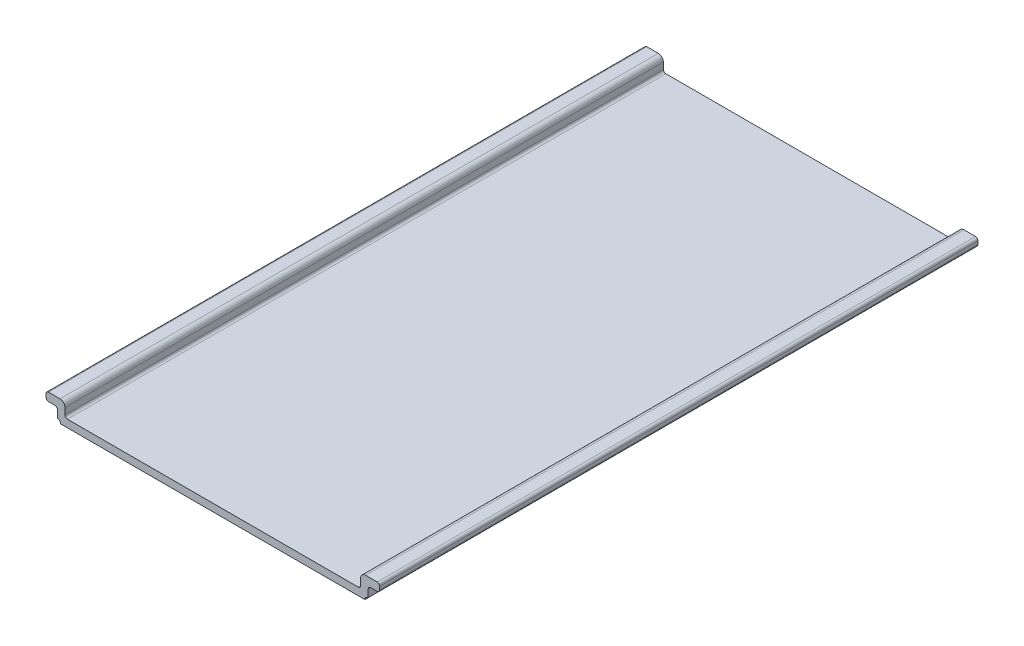
ISO-10303-21;
HEADER;
FILE_DESCRIPTION(('STEP AP214'),'2;1');
FILE_NAME('part.step','',(''),(''),'','','');
FILE_SCHEMA(('AUTOMOTIVE_DESIGN { 1 0 10303 214 1 1 1 1 }'));
ENDSEC;
DATA;
#1=APPLICATION_CONTEXT('core data for automotive mechanical design processes');
#2=APPLICATION_PROTOCOL_DEFINITION('international standard','automotive_design',2000,#1);
#3=PRODUCT_CONTEXT('',#1,'mechanical');
#4=PRODUCT('Part','Part','',(#3));
#5=PRODUCT_RELATED_PRODUCT_CATEGORY('part','',(#4));
#6=PRODUCT_DEFINITION_FORMATION('','',#4);
#7=PRODUCT_DEFINITION_CONTEXT('part definition',#1,'design');
#8=PRODUCT_DEFINITION('design','',#6,#7);
#9=PRODUCT_DEFINITION_SHAPE('','',#8);
#10=(LENGTH_UNIT() NAMED_UNIT(*) SI_UNIT(.MILLI.,.METRE.));
#11=(NAMED_UNIT(*) PLANE_ANGLE_UNIT() SI_UNIT($,.RADIAN.));
#12=(NAMED_UNIT(*) SI_UNIT($,.STERADIAN.) SOLID_ANGLE_UNIT());
#13=UNCERTAINTY_MEASURE_WITH_UNIT(LENGTH_MEASURE(1.E-05),#10,'distance_accuracy_value','');
#14=(GEOMETRIC_REPRESENTATION_CONTEXT(3) GLOBAL_UNCERTAINTY_ASSIGNED_CONTEXT((#13)) GLOBAL_UNIT_ASSIGNED_CONTEXT((#10,
#11,#12)) REPRESENTATION_CONTEXT('',''));
#15=CARTESIAN_POINT('',(0.,0.,0.));
#16=DIRECTION('',(0.,0.,1.));
#17=DIRECTION('',(1.,0.,0.));
#18=AXIS2_PLACEMENT_3D('',#15,#16,#17);
#19=CARTESIAN_POINT('',(-32.95,3.15,0.));
#20=DIRECTION('',(0.,0.,1.));
#21=DIRECTION('',(1.,0.,0.));
#22=AXIS2_PLACEMENT_3D('',#19,#20,#21);
#23=CYLINDRICAL_SURFACE('',#22,0.5);
#24=CARTESIAN_POINT('',(-32.95,3.15,0.));
#25=DIRECTION('',(0.,0.,1.));
#26=DIRECTION('',(1.,0.,0.));
#27=AXIS2_PLACEMENT_3D('',#24,#25,#26);
#28=CIRCLE('',#27,0.5);
#29=CARTESIAN_POINT('',(-33.45,3.15,0.));
#30=VERTEX_POINT('',#29);
#31=CARTESIAN_POINT('',(-32.95,2.65,0.));
#32=VERTEX_POINT('',#31);
#33=EDGE_CURVE('E182',#30,#32,#28,.T.);
#34=ORIENTED_EDGE('',*,*,#33,.T.);
#35=DIRECTION('',(0.,0.,-1.));
#36=VECTOR('',#35,1.);
#37=CARTESIAN_POINT('',(-32.95,2.65,0.));
#38=LINE('',#37,#36);
#39=CARTESIAN_POINT('',(-32.95,2.65,120.));
#40=VERTEX_POINT('',#39);
#41=EDGE_CURVE('E184',#40,#32,#38,.T.);
#42=ORIENTED_EDGE('',*,*,#41,.F.);
#43=CARTESIAN_POINT('',(-32.95,3.15,120.));
#44=DIRECTION('',(0.,0.,1.));
#45=DIRECTION('',(1.,0.,0.));
#46=AXIS2_PLACEMENT_3D('',#43,#44,#45);
#47=CIRCLE('',#46,0.5);
#48=CARTESIAN_POINT('',(-33.45,3.15,120.));
#49=VERTEX_POINT('',#48);
#50=EDGE_CURVE('E20',#40,#49,#47,.F.);
#51=ORIENTED_EDGE('',*,*,#50,.T.);
#52=DIRECTION('',(0.,0.,1.));
#53=VECTOR('',#52,1.);
#54=CARTESIAN_POINT('',(-33.45,3.15,0.));
#55=LINE('',#54,#53);
#56=EDGE_CURVE('E212',#30,#49,#55,.T.);
#57=ORIENTED_EDGE('',*,*,#56,.F.);
#58=EDGE_LOOP('',(#34,#42,#51,#57));
#59=FACE_BOUND('',#58,.T.);
#60=ADVANCED_FACE('F17',(#59),#23,.T.);
#61=CARTESIAN_POINT('',(32.95,3.15,0.));
#62=DIRECTION('',(0.,0.,1.));
#63=DIRECTION('',(1.,0.,0.));
#64=AXIS2_PLACEMENT_3D('',#61,#62,#63);
#65=CYLINDRICAL_SURFACE('',#64,0.5);
#66=CARTESIAN_POINT('',(32.95,3.15,0.));
#67=DIRECTION('',(0.,0.,1.));
#68=DIRECTION('',(1.,0.,0.));
#69=AXIS2_PLACEMENT_3D('',#66,#67,#68);
#70=CIRCLE('',#69,0.5);
#71=CARTESIAN_POINT('',(32.95,2.65,0.));
#72=VERTEX_POINT('',#71);
#73=CARTESIAN_POINT('',(33.45,3.15,0.));
#74=VERTEX_POINT('',#73);
#75=EDGE_CURVE('E194',#72,#74,#70,.T.);
#76=ORIENTED_EDGE('',*,*,#75,.T.);
#77=DIRECTION('',(0.,0.,-1.));
#78=VECTOR('',#77,1.);
#79=CARTESIAN_POINT('',(33.45,3.15,0.));
#80=LINE('',#79,#78);
#81=CARTESIAN_POINT('',(33.45,3.15,120.));
#82=VERTEX_POINT('',#81);
#83=EDGE_CURVE('E207',#82,#74,#80,.T.);
#84=ORIENTED_EDGE('',*,*,#83,.F.);
#85=CARTESIAN_POINT('',(32.95,3.15,120.));
#86=DIRECTION('',(0.,0.,1.));
#87=DIRECTION('',(1.,0.,0.));
#88=AXIS2_PLACEMENT_3D('',#85,#86,#87);
#89=CIRCLE('',#88,0.5);
#90=CARTESIAN_POINT('',(32.95,2.65,120.));
#91=VERTEX_POINT('',#90);
#92=EDGE_CURVE('E196',#82,#91,#89,.F.);
#93=ORIENTED_EDGE('',*,*,#92,.T.);
#94=DIRECTION('',(0.,0.,-1.));
#95=VECTOR('',#94,1.);
#96=CARTESIAN_POINT('',(32.95,2.65,0.));
#97=LINE('',#96,#95);
#98=EDGE_CURVE('E202',#72,#91,#97,.F.);
#99=ORIENTED_EDGE('',*,*,#98,.F.);
#100=EDGE_LOOP('',(#76,#84,#93,#99));
#101=FACE_BOUND('',#100,.T.);
#102=ADVANCED_FACE('F277',(#101),#65,.T.);
#103=CARTESIAN_POINT('',(-31.65,2.65,0.));
#104=DIRECTION('',(0.,-1.,0.));
#105=DIRECTION('',(0.,0.,-1.));
#106=AXIS2_PLACEMENT_3D('',#103,#104,#105);
#107=PLANE('',#106);
#108=DIRECTION('',(1.,0.,0.));
#109=VECTOR('',#108,1.);
#110=CARTESIAN_POINT('',(-31.65,2.65,0.));
#111=LINE('',#110,#109);
#112=CARTESIAN_POINT('',(-31.65,2.65,0.));
#113=VERTEX_POINT('',#112);
#114=EDGE_CURVE('E188',#32,#113,#111,.T.);
#115=ORIENTED_EDGE('',*,*,#114,.T.);
#116=DIRECTION('',(0.,0.,1.));
#117=VECTOR('',#116,1.);
#118=CARTESIAN_POINT('',(-31.65,2.65,0.));
#119=LINE('',#118,#117);
#120=CARTESIAN_POINT('',(-31.65,2.65,120.));
#121=VERTEX_POINT('',#120);
#122=EDGE_CURVE('E192',#113,#121,#119,.T.);
#123=ORIENTED_EDGE('',*,*,#122,.T.);
#124=DIRECTION('',(1.,0.,0.));
#125=VECTOR('',#124,1.);
#126=CARTESIAN_POINT('',(-31.65,2.65,120.));
#127=LINE('',#126,#125);
#128=EDGE_CURVE('E175',#121,#40,#127,.F.);
#129=ORIENTED_EDGE('',*,*,#128,.T.);
#130=ORIENTED_EDGE('',*,*,#41,.T.);
#131=EDGE_LOOP('',(#115,#123,#129,#130));
#132=FACE_BOUND('',#131,.T.);
#133=ADVANCED_FACE('F190',(#132),#107,.T.);
#134=CARTESIAN_POINT('',(-33.45,3.15,0.));
#135=DIRECTION('',(-1.,0.,0.));
#136=DIRECTION('',(0.,0.,1.));
#137=AXIS2_PLACEMENT_3D('',#134,#135,#136);
#138=PLANE('',#137);
#139=DIRECTION('',(0.,1.,0.));
#140=VECTOR('',#139,1.);
#141=CARTESIAN_POINT('',(-33.45,3.15,0.));
#142=LINE('',#141,#140);
#143=CARTESIAN_POINT('',(-33.45,3.79,0.));
#144=VERTEX_POINT('',#143);
#145=EDGE_CURVE('E213',#144,#30,#142,.F.);
#146=ORIENTED_EDGE('',*,*,#145,.T.);
#147=ORIENTED_EDGE('',*,*,#56,.T.);
#148=DIRECTION('',(0.,1.,0.));
#149=VECTOR('',#148,1.);
#150=CARTESIAN_POINT('',(-33.45,3.15,120.));
#151=LINE('',#150,#149);
#152=CARTESIAN_POINT('',(-33.45,3.79,120.));
#153=VERTEX_POINT('',#152);
#154=EDGE_CURVE('E178',#49,#153,#151,.T.);
#155=ORIENTED_EDGE('',*,*,#154,.T.);
#156=DIRECTION('',(0.,0.,1.));
#157=VECTOR('',#156,1.);
#158=CARTESIAN_POINT('',(-33.45,3.79,0.));
#159=LINE('',#158,#157);
#160=EDGE_CURVE('E258',#144,#153,#159,.T.);
#161=ORIENTED_EDGE('',*,*,#160,.F.);
#162=EDGE_LOOP('',(#146,#147,#155,#161));
#163=FACE_BOUND('',#162,.T.);
#164=ADVANCED_FACE('F474',(#163),#138,.T.);
#165=CARTESIAN_POINT('',(33.45,3.79,0.));
#166=DIRECTION('',(1.,0.,0.));
#167=DIRECTION('',(0.,0.,-1.));
#168=AXIS2_PLACEMENT_3D('',#165,#166,#167);
#169=PLANE('',#168);
#170=DIRECTION('',(0.,1.,0.));
#171=VECTOR('',#170,1.);
#172=CARTESIAN_POINT('',(33.45,3.79,0.));
#173=LINE('',#172,#171);
#174=CARTESIAN_POINT('',(33.45,3.79,0.));
#175=VERTEX_POINT('',#174);
#176=EDGE_CURVE('E210',#74,#175,#173,.T.);
#177=ORIENTED_EDGE('',*,*,#176,.T.);
#178=DIRECTION('',(0.,0.,1.));
#179=VECTOR('',#178,1.);
#180=CARTESIAN_POINT('',(33.45,3.79,0.));
#181=LINE('',#180,#179);
#182=CARTESIAN_POINT('',(33.45,3.79,120.));
#183=VERTEX_POINT('',#182);
#184=EDGE_CURVE('E254',#183,#175,#181,.F.);
#185=ORIENTED_EDGE('',*,*,#184,.F.);
#186=DIRECTION('',(0.,1.,0.));
#187=VECTOR('',#186,1.);
#188=CARTESIAN_POINT('',(33.45,3.79,120.));
#189=LINE('',#188,#187);
#190=EDGE_CURVE('E211',#183,#82,#189,.F.);
#191=ORIENTED_EDGE('',*,*,#190,.T.);
#192=ORIENTED_EDGE('',*,*,#83,.T.);
#193=EDGE_LOOP('',(#177,#185,#191,#192));
#194=FACE_BOUND('',#193,.T.);
#195=ADVANCED_FACE('F470',(#194),#169,.T.);
#196=CARTESIAN_POINT('',(29.65,2.,0.));
#197=DIRECTION('',(-1.,0.,0.));
#198=DIRECTION('',(0.,0.,1.));
#199=AXIS2_PLACEMENT_3D('',#196,#197,#198);
#200=PLANE('',#199);
#201=DIRECTION('',(0.,1.,0.));
#202=VECTOR('',#201,1.);
#203=CARTESIAN_POINT('',(29.65,2.,0.));
#204=LINE('',#203,#202);
#205=CARTESIAN_POINT('',(29.65,3.29,0.));
#206=VERTEX_POINT('',#205);
#207=CARTESIAN_POINT('',(29.65,2.,0.));
#208=VERTEX_POINT('',#207);
#209=EDGE_CURVE('E295',#206,#208,#204,.F.);
#210=ORIENTED_EDGE('',*,*,#209,.T.);
#211=DIRECTION('',(0.,0.,1.));
#212=VECTOR('',#211,1.);
#213=CARTESIAN_POINT('',(29.65,2.,0.));
#214=LINE('',#213,#212);
#215=CARTESIAN_POINT('',(29.65,2.,120.));
#216=VERTEX_POINT('',#215);
#217=EDGE_CURVE('E243',#208,#216,#214,.T.);
#218=ORIENTED_EDGE('',*,*,#217,.T.);
#219=DIRECTION('',(0.,1.,0.));
#220=VECTOR('',#219,1.);
#221=CARTESIAN_POINT('',(29.65,2.,120.));
#222=LINE('',#221,#220);
#223=CARTESIAN_POINT('',(29.65,3.29,120.));
#224=VERTEX_POINT('',#223);
#225=EDGE_CURVE('E299',#216,#224,#222,.T.);
#226=ORIENTED_EDGE('',*,*,#225,.T.);
#227=DIRECTION('',(0.,0.,1.));
#228=VECTOR('',#227,1.);
#229=CARTESIAN_POINT('',(29.65,3.29,0.));
#230=LINE('',#229,#228);
#231=EDGE_CURVE('E246',#206,#224,#230,.T.);
#232=ORIENTED_EDGE('',*,*,#231,.F.);
#233=EDGE_LOOP('',(#210,#218,#226,#232));
#234=FACE_BOUND('',#233,.T.);
#235=ADVANCED_FACE('F467',(#234),#200,.T.);
#236=CARTESIAN_POINT('',(-29.65,3.29,0.));
#237=DIRECTION('',(1.,0.,0.));
#238=DIRECTION('',(0.,0.,-1.));
#239=AXIS2_PLACEMENT_3D('',#236,#237,#238);
#240=PLANE('',#239);
#241=DIRECTION('',(0.,1.,0.));
#242=VECTOR('',#241,1.);
#243=CARTESIAN_POINT('',(-29.65,3.29,0.));
#244=LINE('',#243,#242);
#245=CARTESIAN_POINT('',(-29.65,2.,0.));
#246=VERTEX_POINT('',#245);
#247=CARTESIAN_POINT('',(-29.65,3.29,0.));
#248=VERTEX_POINT('',#247);
#249=EDGE_CURVE('E287',#246,#248,#244,.T.);
#250=ORIENTED_EDGE('',*,*,#249,.T.);
#251=DIRECTION('',(0.,0.,1.));
#252=VECTOR('',#251,1.);
#253=CARTESIAN_POINT('',(-29.65,3.29,0.));
#254=LINE('',#253,#252);
#255=CARTESIAN_POINT('',(-29.65,3.29,120.));
#256=VERTEX_POINT('',#255);
#257=EDGE_CURVE('E266',#256,#248,#254,.F.);
#258=ORIENTED_EDGE('',*,*,#257,.F.);
#259=DIRECTION('',(0.,1.,0.));
#260=VECTOR('',#259,1.);
#261=CARTESIAN_POINT('',(-29.65,3.29,120.));
#262=LINE('',#261,#260);
#263=CARTESIAN_POINT('',(-29.65,2.,120.));
#264=VERTEX_POINT('',#263);
#265=EDGE_CURVE('E293',#256,#264,#262,.F.);
#266=ORIENTED_EDGE('',*,*,#265,.T.);
#267=DIRECTION('',(0.,0.,1.));
#268=VECTOR('',#267,1.);
#269=CARTESIAN_POINT('',(-29.65,2.,0.));
#270=LINE('',#269,#268);
#271=EDGE_CURVE('E240',#264,#246,#270,.F.);
#272=ORIENTED_EDGE('',*,*,#271,.T.);
#273=EDGE_LOOP('',(#250,#258,#266,#272));
#274=FACE_BOUND('',#273,.T.);
#275=ADVANCED_FACE('F322',(#274),#240,.T.);
#276=CARTESIAN_POINT('',(32.95,2.65,0.));
#277=DIRECTION('',(0.,-1.,0.));
#278=DIRECTION('',(0.,0.,-1.));
#279=AXIS2_PLACEMENT_3D('',#276,#277,#278);
#280=PLANE('',#279);
#281=DIRECTION('',(1.,0.,0.));
#282=VECTOR('',#281,1.);
#283=CARTESIAN_POINT('',(32.95,2.65,0.));
#284=LINE('',#283,#282);
#285=CARTESIAN_POINT('',(31.65,2.65,0.));
#286=VERTEX_POINT('',#285);
#287=EDGE_CURVE('E206',#286,#72,#284,.T.);
#288=ORIENTED_EDGE('',*,*,#287,.T.);
#289=ORIENTED_EDGE('',*,*,#98,.T.);
#290=DIRECTION('',(1.,0.,0.));
#291=VECTOR('',#290,1.);
#292=CARTESIAN_POINT('',(32.95,2.65,120.));
#293=LINE('',#292,#291);
#294=CARTESIAN_POINT('',(31.65,2.65,120.));
#295=VERTEX_POINT('',#294);
#296=EDGE_CURVE('E283',#91,#295,#293,.F.);
#297=ORIENTED_EDGE('',*,*,#296,.T.);
#298=DIRECTION('',(0.,0.,1.));
#299=VECTOR('',#298,1.);
#300=CARTESIAN_POINT('',(31.65,2.65,0.));
#301=LINE('',#300,#299);
#302=EDGE_CURVE('E234',#295,#286,#301,.F.);
#303=ORIENTED_EDGE('',*,*,#302,.T.);
#304=EDGE_LOOP('',(#288,#289,#297,#303));
#305=FACE_BOUND('',#304,.T.);
#306=ADVANCED_FACE('F281',(#305),#280,.T.);
#307=CARTESIAN_POINT('',(-31.65,2.15,0.));
#308=DIRECTION('',(0.,0.,1.));
#309=DIRECTION('',(1.,0.,0.));
#310=AXIS2_PLACEMENT_3D('',#307,#308,#309);
#311=CYLINDRICAL_SURFACE('',#310,0.5);
#312=ORIENTED_EDGE('',*,*,#122,.F.);
#313=CARTESIAN_POINT('',(-31.65,2.15,0.));
#314=DIRECTION('',(0.,0.,1.));
#315=DIRECTION('',(1.,0.,0.));
#316=AXIS2_PLACEMENT_3D('',#313,#314,#315);
#317=CIRCLE('',#316,0.5);
#318=CARTESIAN_POINT('',(-31.15,2.15,0.));
#319=VERTEX_POINT('',#318);
#320=EDGE_CURVE('E205',#319,#113,#317,.T.);
#321=ORIENTED_EDGE('',*,*,#320,.F.);
#322=DIRECTION('',(0.,0.,1.));
#323=VECTOR('',#322,1.);
#324=CARTESIAN_POINT('',(-31.15,2.15,0.));
#325=LINE('',#324,#323);
#326=CARTESIAN_POINT('',(-31.15,2.15,120.));
#327=VERTEX_POINT('',#326);
#328=EDGE_CURVE('E231',#327,#319,#325,.F.);
#329=ORIENTED_EDGE('',*,*,#328,.F.);
#330=CARTESIAN_POINT('',(-31.65,2.15,120.));
#331=DIRECTION('',(0.,0.,1.));
#332=DIRECTION('',(1.,0.,0.));
#333=AXIS2_PLACEMENT_3D('',#330,#331,#332);
#334=CIRCLE('',#333,0.5);
#335=EDGE_CURVE('E270',#121,#327,#334,.F.);
#336=ORIENTED_EDGE('',*,*,#335,.F.);
#337=EDGE_LOOP('',(#312,#321,#329,#336));
#338=FACE_BOUND('',#337,.T.);
#339=ADVANCED_FACE('F390',(#338),#311,.F.);
#340=CARTESIAN_POINT('',(-30.65,3.29,0.));
#341=DIRECTION('',(0.,0.,1.));
#342=DIRECTION('',(1.,0.,0.));
#343=AXIS2_PLACEMENT_3D('',#340,#341,#342);
#344=CYLINDRICAL_SURFACE('',#343,1.);
#345=CARTESIAN_POINT('',(-30.65,3.29,0.));
#346=DIRECTION('',(0.,0.,1.));
#347=DIRECTION('',(1.,0.,0.));
#348=AXIS2_PLACEMENT_3D('',#345,#346,#347);
#349=CIRCLE('',#348,1.);
#350=CARTESIAN_POINT('',(-30.65,4.29,0.));
#351=VERTEX_POINT('',#350);
#352=EDGE_CURVE('E264',#248,#351,#349,.T.);
#353=ORIENTED_EDGE('',*,*,#352,.T.);
#354=DIRECTION('',(0.,0.,1.));
#355=VECTOR('',#354,1.);
#356=CARTESIAN_POINT('',(-30.65,4.29,0.));
#357=LINE('',#356,#355);
#358=CARTESIAN_POINT('',(-30.65,4.29,120.));
#359=VERTEX_POINT('',#358);
#360=EDGE_CURVE('E377',#359,#351,#357,.F.);
#361=ORIENTED_EDGE('',*,*,#360,.F.);
#362=CARTESIAN_POINT('',(-30.65,3.29,120.));
#363=DIRECTION('',(0.,0.,1.));
#364=DIRECTION('',(1.,0.,0.));
#365=AXIS2_PLACEMENT_3D('',#362,#363,#364);
#366=CIRCLE('',#365,1.);
#367=EDGE_CURVE('E267',#359,#256,#366,.F.);
#368=ORIENTED_EDGE('',*,*,#367,.T.);
#369=ORIENTED_EDGE('',*,*,#257,.T.);
#370=EDGE_LOOP('',(#353,#361,#368,#369));
#371=FACE_BOUND('',#370,.T.);
#372=ADVANCED_FACE('F317',(#371),#344,.T.);
#373=CARTESIAN_POINT('',(-32.95,3.79,0.));
#374=DIRECTION('',(0.,0.,1.));
#375=DIRECTION('',(1.,0.,0.));
#376=AXIS2_PLACEMENT_3D('',#373,#374,#375);
#377=CYLINDRICAL_SURFACE('',#376,0.5);
#378=CARTESIAN_POINT('',(-32.95,3.79,0.));
#379=DIRECTION('',(0.,0.,1.));
#380=DIRECTION('',(1.,0.,0.));
#381=AXIS2_PLACEMENT_3D('',#378,#379,#380);
#382=CIRCLE('',#381,0.5);
#383=CARTESIAN_POINT('',(-32.95,4.29,0.));
#384=VERTEX_POINT('',#383);
#385=EDGE_CURVE('E259',#384,#144,#382,.T.);
#386=ORIENTED_EDGE('',*,*,#385,.T.);
#387=ORIENTED_EDGE('',*,*,#160,.T.);
#388=CARTESIAN_POINT('',(-32.95,3.79,120.));
#389=DIRECTION('',(0.,0.,1.));
#390=DIRECTION('',(1.,0.,0.));
#391=AXIS2_PLACEMENT_3D('',#388,#389,#390);
#392=CIRCLE('',#391,0.5);
#393=CARTESIAN_POINT('',(-32.95,4.29,120.));
#394=VERTEX_POINT('',#393);
#395=EDGE_CURVE('E262',#153,#394,#392,.F.);
#396=ORIENTED_EDGE('',*,*,#395,.T.);
#397=DIRECTION('',(0.,0.,1.));
#398=VECTOR('',#397,1.);
#399=CARTESIAN_POINT('',(-32.95,4.29,0.));
#400=LINE('',#399,#398);
#401=EDGE_CURVE('E371',#384,#394,#400,.T.);
#402=ORIENTED_EDGE('',*,*,#401,.F.);
#403=EDGE_LOOP('',(#386,#387,#396,#402));
#404=FACE_BOUND('',#403,.T.);
#405=ADVANCED_FACE('F454',(#404),#377,.T.);
#406=CARTESIAN_POINT('',(32.95,3.79,0.));
#407=DIRECTION('',(0.,0.,1.));
#408=DIRECTION('',(1.,0.,0.));
#409=AXIS2_PLACEMENT_3D('',#406,#407,#408);
#410=CYLINDRICAL_SURFACE('',#409,0.5);
#411=CARTESIAN_POINT('',(32.95,3.79,0.));
#412=DIRECTION('',(0.,0.,1.));
#413=DIRECTION('',(1.,0.,0.));
#414=AXIS2_PLACEMENT_3D('',#411,#412,#413);
#415=CIRCLE('',#414,0.5);
#416=CARTESIAN_POINT('',(32.95,4.29,0.));
#417=VERTEX_POINT('',#416);
#418=EDGE_CURVE('E252',#175,#417,#415,.T.);
#419=ORIENTED_EDGE('',*,*,#418,.T.);
#420=DIRECTION('',(0.,0.,1.));
#421=VECTOR('',#420,1.);
#422=CARTESIAN_POINT('',(32.95,4.29,0.));
#423=LINE('',#422,#421);
#424=CARTESIAN_POINT('',(32.95,4.29,120.));
#425=VERTEX_POINT('',#424);
#426=EDGE_CURVE('E368',#425,#417,#423,.F.);
#427=ORIENTED_EDGE('',*,*,#426,.F.);
#428=CARTESIAN_POINT('',(32.95,3.79,120.));
#429=DIRECTION('',(0.,0.,1.));
#430=DIRECTION('',(1.,0.,0.));
#431=AXIS2_PLACEMENT_3D('',#428,#429,#430);
#432=CIRCLE('',#431,0.5);
#433=EDGE_CURVE('E255',#425,#183,#432,.F.);
#434=ORIENTED_EDGE('',*,*,#433,.T.);
#435=ORIENTED_EDGE('',*,*,#184,.T.);
#436=EDGE_LOOP('',(#419,#427,#434,#435));
#437=FACE_BOUND('',#436,.T.);
#438=ADVANCED_FACE('F450',(#437),#410,.T.);
#439=CARTESIAN_POINT('',(30.65,3.29,0.));
#440=DIRECTION('',(0.,0.,1.));
#441=DIRECTION('',(1.,0.,0.));
#442=AXIS2_PLACEMENT_3D('',#439,#440,#441);
#443=CYLINDRICAL_SURFACE('',#442,1.);
#444=CARTESIAN_POINT('',(30.65,3.29,0.));
#445=DIRECTION('',(0.,0.,1.));
#446=DIRECTION('',(1.,0.,0.));
#447=AXIS2_PLACEMENT_3D('',#444,#445,#446);
#448=CIRCLE('',#447,1.);
#449=CARTESIAN_POINT('',(30.65,4.29,0.));
#450=VERTEX_POINT('',#449);
#451=EDGE_CURVE('E247',#450,#206,#448,.T.);
#452=ORIENTED_EDGE('',*,*,#451,.T.);
#453=ORIENTED_EDGE('',*,*,#231,.T.);
#454=CARTESIAN_POINT('',(30.65,3.29,120.));
#455=DIRECTION('',(0.,0.,1.));
#456=DIRECTION('',(1.,0.,0.));
#457=AXIS2_PLACEMENT_3D('',#454,#455,#456);
#458=CIRCLE('',#457,1.);
#459=CARTESIAN_POINT('',(30.65,4.29,120.));
#460=VERTEX_POINT('',#459);
#461=EDGE_CURVE('E250',#224,#460,#458,.F.);
#462=ORIENTED_EDGE('',*,*,#461,.T.);
#463=DIRECTION('',(0.,0.,1.));
#464=VECTOR('',#463,1.);
#465=CARTESIAN_POINT('',(30.65,4.29,0.));
#466=LINE('',#465,#464);
#467=EDGE_CURVE('E365',#450,#460,#466,.T.);
#468=ORIENTED_EDGE('',*,*,#467,.F.);
#469=EDGE_LOOP('',(#452,#453,#462,#468));
#470=FACE_BOUND('',#469,.T.);
#471=ADVANCED_FACE('F446',(#470),#443,.T.);
#472=CARTESIAN_POINT('',(29.15,2.,0.));
#473=DIRECTION('',(0.,0.,1.));
#474=DIRECTION('',(1.,0.,0.));
#475=AXIS2_PLACEMENT_3D('',#472,#473,#474);
#476=CYLINDRICAL_SURFACE('',#475,0.5);
#477=ORIENTED_EDGE('',*,*,#217,.F.);
#478=CARTESIAN_POINT('',(29.15,2.,0.));
#479=DIRECTION('',(0.,0.,1.));
#480=DIRECTION('',(1.,0.,0.));
#481=AXIS2_PLACEMENT_3D('',#478,#479,#480);
#482=CIRCLE('',#481,0.5);
#483=CARTESIAN_POINT('',(29.15,1.5,0.));
#484=VERTEX_POINT('',#483);
#485=EDGE_CURVE('E244',#484,#208,#482,.T.);
#486=ORIENTED_EDGE('',*,*,#485,.F.);
#487=DIRECTION('',(0.,0.,1.));
#488=VECTOR('',#487,1.);
#489=CARTESIAN_POINT('',(29.15,1.5,0.));
#490=LINE('',#489,#488);
#491=CARTESIAN_POINT('',(29.15,1.5,120.));
#492=VERTEX_POINT('',#491);
#493=EDGE_CURVE('E361',#492,#484,#490,.F.);
#494=ORIENTED_EDGE('',*,*,#493,.F.);
#495=CARTESIAN_POINT('',(29.15,2.,120.));
#496=DIRECTION('',(0.,0.,1.));
#497=DIRECTION('',(1.,0.,0.));
#498=AXIS2_PLACEMENT_3D('',#495,#496,#497);
#499=CIRCLE('',#498,0.5);
#500=EDGE_CURVE('E241',#216,#492,#499,.F.);
#501=ORIENTED_EDGE('',*,*,#500,.F.);
#502=EDGE_LOOP('',(#477,#486,#494,#501));
#503=FACE_BOUND('',#502,.T.);
#504=ADVANCED_FACE('F442',(#503),#476,.F.);
#505=CARTESIAN_POINT('',(-29.15,2.,0.));
#506=DIRECTION('',(0.,0.,1.));
#507=DIRECTION('',(1.,0.,0.));
#508=AXIS2_PLACEMENT_3D('',#505,#506,#507);
#509=CYLINDRICAL_SURFACE('',#508,0.5);
#510=DIRECTION('',(0.,0.,1.));
#511=VECTOR('',#510,1.);
#512=CARTESIAN_POINT('',(-29.15,1.5,0.));
#513=LINE('',#512,#511);
#514=CARTESIAN_POINT('',(-29.15,1.5,0.));
#515=VERTEX_POINT('',#514);
#516=CARTESIAN_POINT('',(-29.15,1.5,120.));
#517=VERTEX_POINT('',#516);
#518=EDGE_CURVE('E364',#515,#517,#513,.T.);
#519=ORIENTED_EDGE('',*,*,#518,.F.);
#520=CARTESIAN_POINT('',(-29.15,2.,0.));
#521=DIRECTION('',(0.,0.,1.));
#522=DIRECTION('',(1.,0.,0.));
#523=AXIS2_PLACEMENT_3D('',#520,#521,#522);
#524=CIRCLE('',#523,0.5);
#525=EDGE_CURVE('E238',#246,#515,#524,.T.);
#526=ORIENTED_EDGE('',*,*,#525,.F.);
#527=ORIENTED_EDGE('',*,*,#271,.F.);
#528=CARTESIAN_POINT('',(-29.15,2.,120.));
#529=DIRECTION('',(0.,0.,1.));
#530=DIRECTION('',(1.,0.,0.));
#531=AXIS2_PLACEMENT_3D('',#528,#529,#530);
#532=CIRCLE('',#531,0.5);
#533=EDGE_CURVE('E235',#517,#264,#532,.F.);
#534=ORIENTED_EDGE('',*,*,#533,.F.);
#535=EDGE_LOOP('',(#519,#526,#527,#534));
#536=FACE_BOUND('',#535,.T.);
#537=ADVANCED_FACE('F438',(#536),#509,.F.);
#538=CARTESIAN_POINT('',(31.65,2.15,0.));
#539=DIRECTION('',(0.,0.,1.));
#540=DIRECTION('',(1.,0.,0.));
#541=AXIS2_PLACEMENT_3D('',#538,#539,#540);
#542=CYLINDRICAL_SURFACE('',#541,0.5);
#543=DIRECTION('',(0.,0.,-1.));
#544=VECTOR('',#543,1.);
#545=CARTESIAN_POINT('',(31.15,2.15,0.));
#546=LINE('',#545,#544);
#547=CARTESIAN_POINT('',(31.15,2.15,0.));
#548=VERTEX_POINT('',#547);
#549=CARTESIAN_POINT('',(31.15,2.15,120.));
#550=VERTEX_POINT('',#549);
#551=EDGE_CURVE('E357',#548,#550,#546,.F.);
#552=ORIENTED_EDGE('',*,*,#551,.F.);
#553=CARTESIAN_POINT('',(31.65,2.15,0.));
#554=DIRECTION('',(0.,0.,1.));
#555=DIRECTION('',(1.,0.,0.));
#556=AXIS2_PLACEMENT_3D('',#553,#554,#555);
#557=CIRCLE('',#556,0.5);
#558=EDGE_CURVE('E232',#286,#548,#557,.T.);
#559=ORIENTED_EDGE('',*,*,#558,.F.);
#560=ORIENTED_EDGE('',*,*,#302,.F.);
#561=CARTESIAN_POINT('',(31.65,2.15,120.));
#562=DIRECTION('',(0.,0.,1.));
#563=DIRECTION('',(1.,0.,0.));
#564=AXIS2_PLACEMENT_3D('',#561,#562,#563);
#565=CIRCLE('',#564,0.5);
#566=EDGE_CURVE('E228',#550,#295,#565,.F.);
#567=ORIENTED_EDGE('',*,*,#566,.F.);
#568=EDGE_LOOP('',(#552,#559,#560,#567));
#569=FACE_BOUND('',#568,.T.);
#570=ADVANCED_FACE('F435',(#569),#542,.F.);
#571=CARTESIAN_POINT('',(-31.15,0.639999999999996,0.));
#572=DIRECTION('',(-1.,0.,0.));
#573=DIRECTION('',(0.,0.,1.));
#574=AXIS2_PLACEMENT_3D('',#571,#572,#573);
#575=PLANE('',#574);
#576=DIRECTION('',(0.,1.,0.));
#577=VECTOR('',#576,1.);
#578=CARTESIAN_POINT('',(-31.15,0.639999999999996,0.));
#579=LINE('',#578,#577);
#580=CARTESIAN_POINT('',(-31.15,0.639999999999997,0.));
#581=VERTEX_POINT('',#580);
#582=EDGE_CURVE('E379',#319,#581,#579,.F.);
#583=ORIENTED_EDGE('',*,*,#582,.T.);
#584=DIRECTION('',(0.,0.,1.));
#585=VECTOR('',#584,1.);
#586=CARTESIAN_POINT('',(-31.15,0.639999999999997,0.));
#587=LINE('',#586,#585);
#588=CARTESIAN_POINT('',(-31.15,0.639999999999997,120.));
#589=VERTEX_POINT('',#588);
#590=EDGE_CURVE('E227',#581,#589,#587,.T.);
#591=ORIENTED_EDGE('',*,*,#590,.T.);
#592=DIRECTION('',(0.,1.,0.));
#593=VECTOR('',#592,1.);
#594=CARTESIAN_POINT('',(-31.15,1.09796098678081,120.));
#595=LINE('',#594,#593);
#596=EDGE_CURVE('E348',#327,#589,#595,.F.);
#597=ORIENTED_EDGE('',*,*,#596,.F.);
#598=ORIENTED_EDGE('',*,*,#328,.T.);
#599=EDGE_LOOP('',(#583,#591,#597,#598));
#600=FACE_BOUND('',#599,.T.);
#601=ADVANCED_FACE('F386',(#600),#575,.T.);
#602=CARTESIAN_POINT('',(-32.95,4.29,0.));
#603=DIRECTION('',(0.,1.,0.));
#604=DIRECTION('',(0.,0.,1.));
#605=AXIS2_PLACEMENT_3D('',#602,#603,#604);
#606=PLANE('',#605);
#607=DIRECTION('',(1.,0.,0.));
#608=VECTOR('',#607,1.);
#609=CARTESIAN_POINT('',(-17.4544719437255,4.29,0.));
#610=LINE('',#609,#608);
#611=EDGE_CURVE('E224',#351,#384,#610,.F.);
#612=ORIENTED_EDGE('',*,*,#611,.T.);
#613=ORIENTED_EDGE('',*,*,#401,.T.);
#614=DIRECTION('',(1.,0.,0.));
#615=VECTOR('',#614,1.);
#616=CARTESIAN_POINT('',(-17.4544719437255,4.29,120.));
#617=LINE('',#616,#615);
#618=EDGE_CURVE('E351',#359,#394,#617,.F.);
#619=ORIENTED_EDGE('',*,*,#618,.F.);
#620=ORIENTED_EDGE('',*,*,#360,.T.);
#621=EDGE_LOOP('',(#612,#613,#619,#620));
#622=FACE_BOUND('',#621,.T.);
#623=ADVANCED_FACE('F429',(#622),#606,.T.);
#624=CARTESIAN_POINT('',(30.65,4.29,0.));
#625=DIRECTION('',(0.,1.,0.));
#626=DIRECTION('',(0.,0.,1.));
#627=AXIS2_PLACEMENT_3D('',#624,#625,#626);
#628=PLANE('',#627);
#629=DIRECTION('',(1.,0.,0.));
#630=VECTOR('',#629,1.);
#631=CARTESIAN_POINT('',(-17.4544719437255,4.29,0.));
#632=LINE('',#631,#630);
#633=EDGE_CURVE('E649',#417,#450,#632,.F.);
#634=ORIENTED_EDGE('',*,*,#633,.T.);
#635=ORIENTED_EDGE('',*,*,#467,.T.);
#636=DIRECTION('',(1.,0.,0.));
#637=VECTOR('',#636,1.);
#638=CARTESIAN_POINT('',(-17.4544719437255,4.29,120.));
#639=LINE('',#638,#637);
#640=EDGE_CURVE('E342',#425,#460,#639,.F.);
#641=ORIENTED_EDGE('',*,*,#640,.F.);
#642=ORIENTED_EDGE('',*,*,#426,.T.);
#643=EDGE_LOOP('',(#634,#635,#641,#642));
#644=FACE_BOUND('',#643,.T.);
#645=ADVANCED_FACE('F425',(#644),#628,.T.);
#646=CARTESIAN_POINT('',(-29.15,1.5,0.));
#647=DIRECTION('',(0.,1.,0.));
#648=DIRECTION('',(0.,0.,1.));
#649=AXIS2_PLACEMENT_3D('',#646,#647,#648);
#650=PLANE('',#649);
#651=DIRECTION('',(1.,0.,0.));
#652=VECTOR('',#651,1.);
#653=CARTESIAN_POINT('',(-17.4544719437255,1.5,0.));
#654=LINE('',#653,#652);
#655=EDGE_CURVE('E360',#484,#515,#654,.F.);
#656=ORIENTED_EDGE('',*,*,#655,.T.);
#657=ORIENTED_EDGE('',*,*,#518,.T.);
#658=DIRECTION('',(1.,0.,0.));
#659=VECTOR('',#658,1.);
#660=CARTESIAN_POINT('',(-17.4544719437255,1.5,120.));
#661=LINE('',#660,#659);
#662=EDGE_CURVE('E354',#492,#517,#661,.F.);
#663=ORIENTED_EDGE('',*,*,#662,.F.);
#664=ORIENTED_EDGE('',*,*,#493,.T.);
#665=EDGE_LOOP('',(#656,#657,#663,#664));
#666=FACE_BOUND('',#665,.T.);
#667=ADVANCED_FACE('F421',(#666),#650,.T.);
#668=CARTESIAN_POINT('',(31.15,2.15,0.));
#669=DIRECTION('',(1.,0.,0.));
#670=DIRECTION('',(0.,0.,-1.));
#671=AXIS2_PLACEMENT_3D('',#668,#669,#670);
#672=PLANE('',#671);
#673=DIRECTION('',(0.,1.,0.));
#674=VECTOR('',#673,1.);
#675=CARTESIAN_POINT('',(31.15,1.09796098678081,0.));
#676=LINE('',#675,#674);
#677=CARTESIAN_POINT('',(31.15,0.639999999999997,0.));
#678=VERTEX_POINT('',#677);
#679=EDGE_CURVE('E223',#678,#548,#676,.T.);
#680=ORIENTED_EDGE('',*,*,#679,.T.);
#681=ORIENTED_EDGE('',*,*,#551,.T.);
#682=DIRECTION('',(0.,1.,0.));
#683=VECTOR('',#682,1.);
#684=CARTESIAN_POINT('',(31.15,1.09796098678081,120.));
#685=LINE('',#684,#683);
#686=CARTESIAN_POINT('',(31.15,0.639999999999997,120.));
#687=VERTEX_POINT('',#686);
#688=EDGE_CURVE('E345',#687,#550,#685,.T.);
#689=ORIENTED_EDGE('',*,*,#688,.F.);
#690=DIRECTION('',(0.,0.,1.));
#691=VECTOR('',#690,1.);
#692=CARTESIAN_POINT('',(31.15,0.639999999999997,0.));
#693=LINE('',#692,#691);
#694=EDGE_CURVE('E220',#687,#678,#693,.F.);
#695=ORIENTED_EDGE('',*,*,#694,.T.);
#696=EDGE_LOOP('',(#680,#681,#689,#695));
#697=FACE_BOUND('',#696,.T.);
#698=ADVANCED_FACE('F418',(#697),#672,.T.);
#699=CARTESIAN_POINT('',(-17.4544719437255,1.09796098678081,120.));
#700=DIRECTION('',(0.,0.,1.));
#701=DIRECTION('',(1.,0.,0.));
#702=AXIS2_PLACEMENT_3D('',#699,#700,#701);
#703=PLANE('',#702);
#704=ORIENTED_EDGE('',*,*,#225,.F.);
#705=ORIENTED_EDGE('',*,*,#500,.T.);
#706=ORIENTED_EDGE('',*,*,#662,.T.);
#707=ORIENTED_EDGE('',*,*,#533,.T.);
#708=ORIENTED_EDGE('',*,*,#265,.F.);
#709=ORIENTED_EDGE('',*,*,#367,.F.);
#710=ORIENTED_EDGE('',*,*,#618,.T.);
#711=ORIENTED_EDGE('',*,*,#395,.F.);
#712=ORIENTED_EDGE('',*,*,#154,.F.);
#713=ORIENTED_EDGE('',*,*,#50,.F.);
#714=ORIENTED_EDGE('',*,*,#128,.F.);
#715=ORIENTED_EDGE('',*,*,#335,.T.);
#716=ORIENTED_EDGE('',*,*,#596,.T.);
#717=CARTESIAN_POINT('',(-31.15,0.,120.));
#718=DIRECTION('',(0.,0.,1.));
#719=DIRECTION('',(1.,0.,0.));
#720=AXIS2_PLACEMENT_3D('',#717,#718,#719);
#721=CIRCLE('',#720,0.64);
#722=CARTESIAN_POINT('',(-30.51,0.,120.));
#723=VERTEX_POINT('',#722);
#724=EDGE_CURVE('E225',#589,#723,#721,.F.);
#725=ORIENTED_EDGE('',*,*,#724,.T.);
#726=DIRECTION('',(1.,0.,0.));
#727=VECTOR('',#726,1.);
#728=CARTESIAN_POINT('',(0.,0.,120.));
#729=LINE('',#728,#727);
#730=CARTESIAN_POINT('',(30.51,0.,120.));
#731=VERTEX_POINT('',#730);
#732=EDGE_CURVE('E218',#731,#723,#729,.F.);
#733=ORIENTED_EDGE('',*,*,#732,.F.);
#734=CARTESIAN_POINT('',(31.15,0.,120.));
#735=DIRECTION('',(0.,0.,1.));
#736=DIRECTION('',(1.,0.,0.));
#737=AXIS2_PLACEMENT_3D('',#734,#735,#736);
#738=CIRCLE('',#737,0.64);
#739=EDGE_CURVE('E215',#731,#687,#738,.F.);
#740=ORIENTED_EDGE('',*,*,#739,.T.);
#741=ORIENTED_EDGE('',*,*,#688,.T.);
#742=ORIENTED_EDGE('',*,*,#566,.T.);
#743=ORIENTED_EDGE('',*,*,#296,.F.);
#744=ORIENTED_EDGE('',*,*,#92,.F.);
#745=ORIENTED_EDGE('',*,*,#190,.F.);
#746=ORIENTED_EDGE('',*,*,#433,.F.);
#747=ORIENTED_EDGE('',*,*,#640,.T.);
#748=ORIENTED_EDGE('',*,*,#461,.F.);
#749=EDGE_LOOP('',(#704,#705,#706,#707,#708,#709,#710,#711,#712,#713,#714,#715,#716,#725,#733,
#740,#741,#742,#743,#744,#745,#746,#747,#748));
#750=FACE_BOUND('',#749,.T.);
#751=ADVANCED_FACE('F173',(#750),#703,.T.);
#752=CARTESIAN_POINT('',(-31.15,0.,0.));
#753=DIRECTION('',(0.,0.,1.));
#754=DIRECTION('',(1.,0.,0.));
#755=AXIS2_PLACEMENT_3D('',#752,#753,#754);
#756=CYLINDRICAL_SURFACE('',#755,0.64);
#757=ORIENTED_EDGE('',*,*,#590,.F.);
#758=CARTESIAN_POINT('',(-31.15,0.,0.));
#759=DIRECTION('',(0.,0.,1.));
#760=DIRECTION('',(1.,0.,0.));
#761=AXIS2_PLACEMENT_3D('',#758,#759,#760);
#762=CIRCLE('',#761,0.64);
#763=CARTESIAN_POINT('',(-30.51,0.,0.));
#764=VERTEX_POINT('',#763);
#765=EDGE_CURVE('E221',#581,#764,#762,.F.);
#766=ORIENTED_EDGE('',*,*,#765,.T.);
#767=DIRECTION('',(0.,0.,-1.));
#768=VECTOR('',#767,1.);
#769=CARTESIAN_POINT('',(-30.51,0.,0.));
#770=LINE('',#769,#768);
#771=EDGE_CURVE('E335',#723,#764,#770,.T.);
#772=ORIENTED_EDGE('',*,*,#771,.F.);
#773=ORIENTED_EDGE('',*,*,#724,.F.);
#774=EDGE_LOOP('',(#757,#766,#772,#773));
#775=FACE_BOUND('',#774,.T.);
#776=ADVANCED_FACE('F394',(#775),#756,.F.);
#777=CARTESIAN_POINT('',(-17.4544719437255,1.09796098678081,0.));
#778=DIRECTION('',(0.,0.,1.));
#779=DIRECTION('',(1.,0.,0.));
#780=AXIS2_PLACEMENT_3D('',#777,#778,#779);
#781=PLANE('',#780);
#782=ORIENTED_EDGE('',*,*,#485,.T.);
#783=ORIENTED_EDGE('',*,*,#209,.F.);
#784=ORIENTED_EDGE('',*,*,#451,.F.);
#785=ORIENTED_EDGE('',*,*,#633,.F.);
#786=ORIENTED_EDGE('',*,*,#418,.F.);
#787=ORIENTED_EDGE('',*,*,#176,.F.);
#788=ORIENTED_EDGE('',*,*,#75,.F.);
#789=ORIENTED_EDGE('',*,*,#287,.F.);
#790=ORIENTED_EDGE('',*,*,#558,.T.);
#791=ORIENTED_EDGE('',*,*,#679,.F.);
#792=CARTESIAN_POINT('',(31.15,0.,0.));
#793=DIRECTION('',(0.,0.,1.));
#794=DIRECTION('',(1.,0.,0.));
#795=AXIS2_PLACEMENT_3D('',#792,#793,#794);
#796=CIRCLE('',#795,0.64);
#797=CARTESIAN_POINT('',(30.51,0.,0.));
#798=VERTEX_POINT('',#797);
#799=EDGE_CURVE('E35',#678,#798,#796,.T.);
#800=ORIENTED_EDGE('',*,*,#799,.T.);
#801=DIRECTION('',(1.,0.,0.));
#802=VECTOR('',#801,1.);
#803=CARTESIAN_POINT('',(0.,0.,0.));
#804=LINE('',#803,#802);
#805=EDGE_CURVE('E26',#764,#798,#804,.T.);
#806=ORIENTED_EDGE('',*,*,#805,.F.);
#807=ORIENTED_EDGE('',*,*,#765,.F.);
#808=ORIENTED_EDGE('',*,*,#582,.F.);
#809=ORIENTED_EDGE('',*,*,#320,.T.);
#810=ORIENTED_EDGE('',*,*,#114,.F.);
#811=ORIENTED_EDGE('',*,*,#33,.F.);
#812=ORIENTED_EDGE('',*,*,#145,.F.);
#813=ORIENTED_EDGE('',*,*,#385,.F.);
#814=ORIENTED_EDGE('',*,*,#611,.F.);
#815=ORIENTED_EDGE('',*,*,#352,.F.);
#816=ORIENTED_EDGE('',*,*,#249,.F.);
#817=ORIENTED_EDGE('',*,*,#525,.T.);
#818=ORIENTED_EDGE('',*,*,#655,.F.);
#819=EDGE_LOOP('',(#782,#783,#784,#785,#786,#787,#788,#789,#790,#791,#800,#806,#807,#808,#809,
#810,#811,#812,#813,#814,#815,#816,#817,#818));
#820=FACE_BOUND('',#819,.T.);
#821=ADVANCED_FACE('F326',(#820),#781,.F.);
#822=CARTESIAN_POINT('',(31.15,0.,0.));
#823=DIRECTION('',(0.,0.,1.));
#824=DIRECTION('',(1.,0.,0.));
#825=AXIS2_PLACEMENT_3D('',#822,#823,#824);
#826=CYLINDRICAL_SURFACE('',#825,0.64);
#827=DIRECTION('',(0.,0.,-1.));
#828=VECTOR('',#827,1.);
#829=CARTESIAN_POINT('',(30.51,0.,0.));
#830=LINE('',#829,#828);
#831=EDGE_CURVE('E11',#798,#731,#830,.F.);
#832=ORIENTED_EDGE('',*,*,#831,.F.);
#833=ORIENTED_EDGE('',*,*,#799,.F.);
#834=ORIENTED_EDGE('',*,*,#694,.F.);
#835=ORIENTED_EDGE('',*,*,#739,.F.);
#836=EDGE_LOOP('',(#832,#833,#834,#835));
#837=FACE_BOUND('',#836,.T.);
#838=ADVANCED_FACE('F402',(#837),#826,.F.);
#839=CARTESIAN_POINT('',(0.,0.,0.));
#840=DIRECTION('',(0.,-1.,0.));
#841=DIRECTION('',(0.,0.,-1.));
#842=AXIS2_PLACEMENT_3D('',#839,#840,#841);
#843=PLANE('',#842);
#844=ORIENTED_EDGE('',*,*,#805,.T.);
#845=ORIENTED_EDGE('',*,*,#831,.T.);
#846=ORIENTED_EDGE('',*,*,#732,.T.);
#847=ORIENTED_EDGE('',*,*,#771,.T.);
#848=EDGE_LOOP('',(#844,#845,#846,#847));
#849=FACE_BOUND('',#848,.T.);
#850=ADVANCED_FACE('F403',(#849),#843,.T.);
#851=CLOSED_SHELL('',(#60,#102,#133,#164,#195,#235,#275,#306,#339,#372,#405,#438,#471,#504,#537,
#570,#601,#623,#645,#667,#698,#751,#776,#821,#838,#850));
#852=MANIFOLD_SOLID_BREP('B1',#851);
#853=ADVANCED_BREP_SHAPE_REPRESENTATION('',(#18,#852),#14);
#854=SHAPE_DEFINITION_REPRESENTATION(#9,#853);
ENDSEC;
END-ISO-10303-21;
